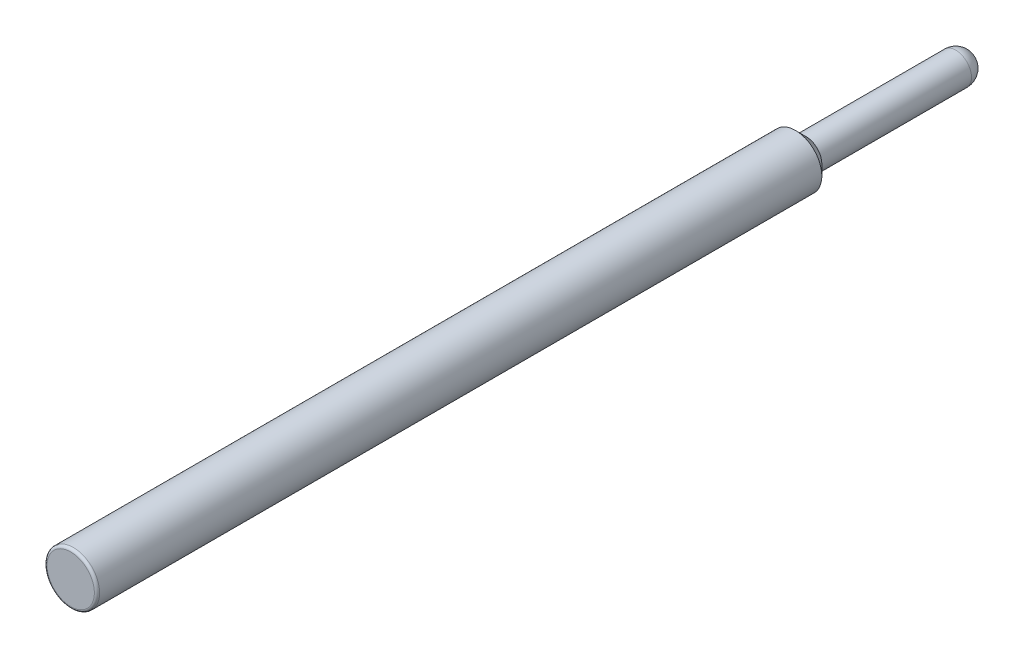
ISO-10303-21;
HEADER;
FILE_DESCRIPTION(('STEP AP214'),'2;1');
FILE_NAME('part.step','',(''),(''),'','','');
FILE_SCHEMA(('AUTOMOTIVE_DESIGN { 1 0 10303 214 1 1 1 1 }'));
ENDSEC;
DATA;
#1=APPLICATION_CONTEXT('core data for automotive mechanical design processes');
#2=APPLICATION_PROTOCOL_DEFINITION('international standard','automotive_design',2000,#1);
#3=PRODUCT_CONTEXT('',#1,'mechanical');
#4=PRODUCT('Part','Part','',(#3));
#5=PRODUCT_RELATED_PRODUCT_CATEGORY('part','',(#4));
#6=PRODUCT_DEFINITION_FORMATION('','',#4);
#7=PRODUCT_DEFINITION_CONTEXT('part definition',#1,'design');
#8=PRODUCT_DEFINITION('design','',#6,#7);
#9=PRODUCT_DEFINITION_SHAPE('','',#8);
#10=(LENGTH_UNIT() NAMED_UNIT(*) SI_UNIT(.MILLI.,.METRE.));
#11=(NAMED_UNIT(*) PLANE_ANGLE_UNIT() SI_UNIT($,.RADIAN.));
#12=(NAMED_UNIT(*) SI_UNIT($,.STERADIAN.) SOLID_ANGLE_UNIT());
#13=UNCERTAINTY_MEASURE_WITH_UNIT(LENGTH_MEASURE(1.E-05),#10,'distance_accuracy_value','');
#14=(GEOMETRIC_REPRESENTATION_CONTEXT(3) GLOBAL_UNCERTAINTY_ASSIGNED_CONTEXT((#13)) GLOBAL_UNIT_ASSIGNED_CONTEXT((#10,
#11,#12)) REPRESENTATION_CONTEXT('',''));
#15=CARTESIAN_POINT('',(0.,0.,0.));
#16=DIRECTION('',(0.,0.,1.));
#17=DIRECTION('',(1.,0.,0.));
#18=AXIS2_PLACEMENT_3D('',#15,#16,#17);
#19=CARTESIAN_POINT('',(0.,0.,0.));
#20=DIRECTION('',(0.,0.,-1.));
#21=DIRECTION('',(-1.,0.,0.));
#22=AXIS2_PLACEMENT_3D('',#19,#20,#21);
#23=PLANE('',#22);
#24=CARTESIAN_POINT('',(0.,0.,0.));
#25=DIRECTION('',(0.,0.,-1.));
#26=DIRECTION('',(-1.,0.,0.));
#27=AXIS2_PLACEMENT_3D('',#24,#25,#26);
#28=CIRCLE('',#27,9.00000000000004);
#29=CARTESIAN_POINT('',(-9.00000000000004,0.,0.));
#30=VERTEX_POINT('',#29);
#31=EDGE_CURVE('E10',#30,#30,#28,.T.);
#32=ORIENTED_EDGE('',*,*,#31,.F.);
#33=EDGE_LOOP('',(#32));
#34=FACE_BOUND('',#33,.T.);
#35=ADVANCED_FACE('F37',(#34),#23,.F.);
#36=CARTESIAN_POINT('',(0.,0.,-1.));
#37=DIRECTION('',(0.,0.,-1.));
#38=DIRECTION('',(-1.,0.,0.));
#39=AXIS2_PLACEMENT_3D('',#36,#37,#38);
#40=TOROIDAL_SURFACE('',#39,9.00000000000004,1.);
#41=CARTESIAN_POINT('',(0.,0.,-1.));
#42=DIRECTION('',(0.,0.,-1.));
#43=DIRECTION('',(-1.,0.,0.));
#44=AXIS2_PLACEMENT_3D('',#41,#42,#43);
#45=CIRCLE('',#44,10.);
#46=CARTESIAN_POINT('',(-10.,0.,-1.));
#47=VERTEX_POINT('',#46);
#48=EDGE_CURVE('E43',#47,#47,#45,.T.);
#49=ORIENTED_EDGE('',*,*,#48,.F.);
#50=EDGE_LOOP('',(#49));
#51=FACE_BOUND('',#50,.T.);
#52=ORIENTED_EDGE('',*,*,#31,.T.);
#53=EDGE_LOOP('',(#52));
#54=FACE_BOUND('',#53,.T.);
#55=ADVANCED_FACE('F76',(#51,#54),#40,.T.);
#56=CARTESIAN_POINT('',(0.,0.,-347.378132428889));
#57=DIRECTION('',(0.,0.,-1.));
#58=DIRECTION('',(-1.,0.,0.));
#59=AXIS2_PLACEMENT_3D('',#56,#57,#58);
#60=CYLINDRICAL_SURFACE('',#59,10.);
#61=CARTESIAN_POINT('',(0.,0.,-276.));
#62=DIRECTION('',(0.,0.,-1.));
#63=DIRECTION('',(-1.,0.,0.));
#64=AXIS2_PLACEMENT_3D('',#61,#62,#63);
#65=CIRCLE('',#64,10.);
#66=CARTESIAN_POINT('',(-10.,0.,-276.));
#67=VERTEX_POINT('',#66);
#68=EDGE_CURVE('E47',#67,#67,#65,.T.);
#69=ORIENTED_EDGE('',*,*,#68,.F.);
#70=EDGE_LOOP('',(#69));
#71=FACE_BOUND('',#70,.T.);
#72=ORIENTED_EDGE('',*,*,#48,.T.);
#73=EDGE_LOOP('',(#72));
#74=FACE_BOUND('',#73,.T.);
#75=ADVANCED_FACE('F71',(#71,#74),#60,.T.);
#76=CARTESIAN_POINT('',(0.,0.,-276.));
#77=DIRECTION('',(0.,0.,1.));
#78=DIRECTION('',(1.,0.,0.));
#79=AXIS2_PLACEMENT_3D('',#76,#77,#78);
#80=CONICAL_SURFACE('',#79,10.,0.785398163397457);
#81=CARTESIAN_POINT('',(0.,0.,-280.));
#82=DIRECTION('',(0.,0.,-1.));
#83=DIRECTION('',(-1.,0.,0.));
#84=AXIS2_PLACEMENT_3D('',#81,#82,#83);
#85=CIRCLE('',#84,5.99999999999992);
#86=CARTESIAN_POINT('',(-5.99999999999992,0.,-280.));
#87=VERTEX_POINT('',#86);
#88=EDGE_CURVE('E51',#87,#87,#85,.T.);
#89=ORIENTED_EDGE('',*,*,#88,.F.);
#90=EDGE_LOOP('',(#89));
#91=FACE_BOUND('',#90,.T.);
#92=ORIENTED_EDGE('',*,*,#68,.T.);
#93=EDGE_LOOP('',(#92));
#94=FACE_BOUND('',#93,.T.);
#95=ADVANCED_FACE('F65',(#91,#94),#80,.T.);
#96=CARTESIAN_POINT('',(0.,0.,-347.378132428889));
#97=DIRECTION('',(0.,0.,-1.));
#98=DIRECTION('',(-1.,0.,0.));
#99=AXIS2_PLACEMENT_3D('',#96,#97,#98);
#100=CYLINDRICAL_SURFACE('',#99,5.99999999999994);
#101=CARTESIAN_POINT('',(0.,0.,-337.));
#102=DIRECTION('',(0.,0.,-1.));
#103=DIRECTION('',(-1.,0.,0.));
#104=AXIS2_PLACEMENT_3D('',#101,#102,#103);
#105=CIRCLE('',#104,5.99999999999997);
#106=CARTESIAN_POINT('',(-5.99999999999997,0.,-337.));
#107=VERTEX_POINT('',#106);
#108=EDGE_CURVE('E56',#107,#107,#105,.T.);
#109=ORIENTED_EDGE('',*,*,#108,.F.);
#110=EDGE_LOOP('',(#109));
#111=FACE_BOUND('',#110,.T.);
#112=ORIENTED_EDGE('',*,*,#88,.T.);
#113=EDGE_LOOP('',(#112));
#114=FACE_BOUND('',#113,.T.);
#115=ADVANCED_FACE('F62',(#111,#114),#100,.T.);
#116=CARTESIAN_POINT('',(0.,0.,-337.));
#117=DIRECTION('',(0.,0.,-1.));
#118=DIRECTION('',(1.,0.,0.));
#119=AXIS2_PLACEMENT_3D('',#116,#117,#118);
#120=SPHERICAL_SURFACE('',#119,5.99999999999995);
#121=ORIENTED_EDGE('',*,*,#108,.T.);
#122=EDGE_LOOP('',(#121));
#123=FACE_BOUND('',#122,.T.);
#124=ADVANCED_FACE('F60',(#123),#120,.T.);
#125=CLOSED_SHELL('',(#35,#55,#75,#95,#115,#124));
#126=MANIFOLD_SOLID_BREP('B2',#125);
#127=ADVANCED_BREP_SHAPE_REPRESENTATION('',(#18,#126),#14);
#128=SHAPE_DEFINITION_REPRESENTATION(#9,#127);
ENDSEC;
END-ISO-10303-21;
